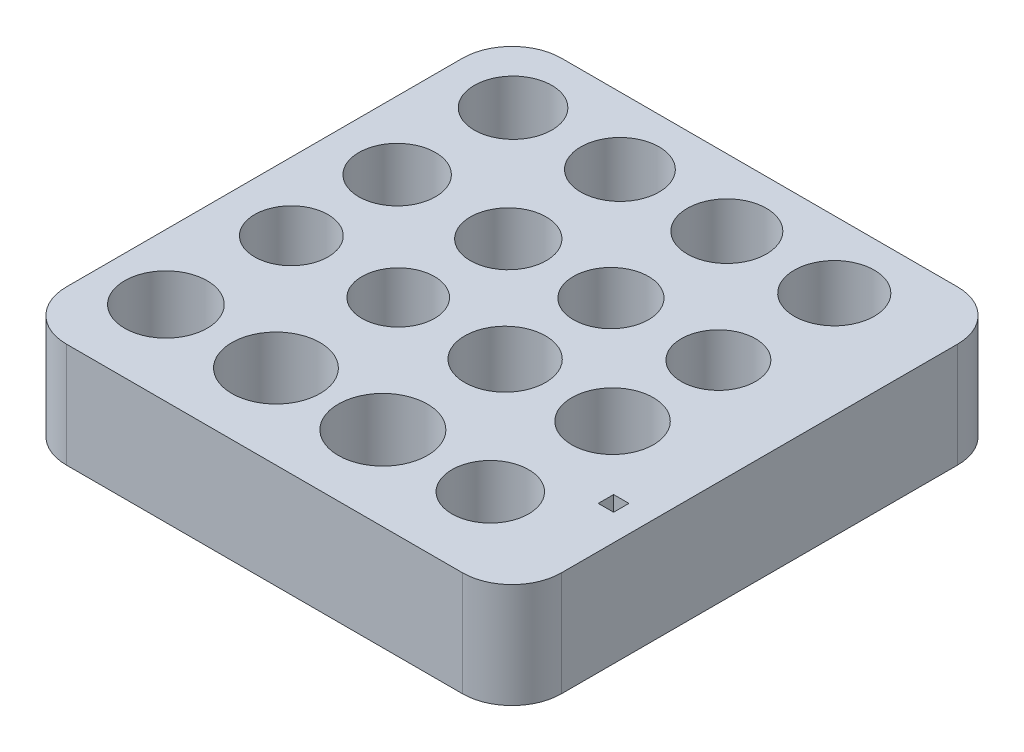
ISO-10303-21;
HEADER;
FILE_DESCRIPTION(('STEP AP214'),'2;1');
FILE_NAME('part.step','',(''),(''),'','','');
FILE_SCHEMA(('AUTOMOTIVE_DESIGN { 1 0 10303 214 1 1 1 1 }'));
ENDSEC;
DATA;
#1=APPLICATION_CONTEXT('core data for automotive mechanical design processes');
#2=APPLICATION_PROTOCOL_DEFINITION('international standard','automotive_design',2000,#1);
#3=PRODUCT_CONTEXT('',#1,'mechanical');
#4=PRODUCT('Part','Part','',(#3));
#5=PRODUCT_RELATED_PRODUCT_CATEGORY('part','',(#4));
#6=PRODUCT_DEFINITION_FORMATION('','',#4);
#7=PRODUCT_DEFINITION_CONTEXT('part definition',#1,'design');
#8=PRODUCT_DEFINITION('design','',#6,#7);
#9=PRODUCT_DEFINITION_SHAPE('','',#8);
#10=(LENGTH_UNIT() NAMED_UNIT(*) SI_UNIT(.MILLI.,.METRE.));
#11=(NAMED_UNIT(*) PLANE_ANGLE_UNIT() SI_UNIT($,.RADIAN.));
#12=(NAMED_UNIT(*) SI_UNIT($,.STERADIAN.) SOLID_ANGLE_UNIT());
#13=UNCERTAINTY_MEASURE_WITH_UNIT(LENGTH_MEASURE(1.E-05),#10,'distance_accuracy_value','');
#14=(GEOMETRIC_REPRESENTATION_CONTEXT(3) GLOBAL_UNCERTAINTY_ASSIGNED_CONTEXT((#13)) GLOBAL_UNIT_ASSIGNED_CONTEXT((#10,
#11,#12)) REPRESENTATION_CONTEXT('',''));
#15=CARTESIAN_POINT('',(0.,0.,0.));
#16=DIRECTION('',(0.,0.,1.));
#17=DIRECTION('',(1.,0.,0.));
#18=AXIS2_PLACEMENT_3D('',#15,#16,#17);
#19=CARTESIAN_POINT('',(3.,6.35,-3.));
#20=DIRECTION('',(0.,-1.,0.));
#21=DIRECTION('',(0.,0.,-1.));
#22=AXIS2_PLACEMENT_3D('',#19,#20,#21);
#23=CYLINDRICAL_SURFACE('',#22,3.);
#24=CARTESIAN_POINT('',(3.,0.,-3.));
#25=DIRECTION('',(0.,1.,0.));
#26=DIRECTION('',(0.,0.,-1.));
#27=AXIS2_PLACEMENT_3D('',#24,#25,#26);
#28=CIRCLE('',#27,3.);
#29=CARTESIAN_POINT('',(0.,0.,-3.00000000000002));
#30=VERTEX_POINT('',#29);
#31=CARTESIAN_POINT('',(3.00000000000002,0.,0.));
#32=VERTEX_POINT('',#31);
#33=EDGE_CURVE('E281',#30,#32,#28,.T.);
#34=ORIENTED_EDGE('',*,*,#33,.T.);
#35=DIRECTION('',(0.,-1.,0.));
#36=VECTOR('',#35,1.);
#37=CARTESIAN_POINT('',(3.00000000000002,6.35,0.));
#38=LINE('',#37,#36);
#39=CARTESIAN_POINT('',(3.00000000000002,6.35,0.));
#40=VERTEX_POINT('',#39);
#41=EDGE_CURVE('E11',#40,#32,#38,.T.);
#42=ORIENTED_EDGE('',*,*,#41,.F.);
#43=CARTESIAN_POINT('',(3.,6.35,-3.));
#44=DIRECTION('',(0.,1.,0.));
#45=DIRECTION('',(0.,0.,-1.));
#46=AXIS2_PLACEMENT_3D('',#43,#44,#45);
#47=CIRCLE('',#46,3.);
#48=CARTESIAN_POINT('',(0.,6.35,-3.00000000000002));
#49=VERTEX_POINT('',#48);
#50=EDGE_CURVE('E285',#49,#40,#47,.T.);
#51=ORIENTED_EDGE('',*,*,#50,.F.);
#52=DIRECTION('',(0.,-1.,0.));
#53=VECTOR('',#52,1.);
#54=CARTESIAN_POINT('',(0.,6.35,-3.00000000000002));
#55=LINE('',#54,#53);
#56=EDGE_CURVE('E311',#49,#30,#55,.T.);
#57=ORIENTED_EDGE('',*,*,#56,.T.);
#58=EDGE_LOOP('',(#34,#42,#51,#57));
#59=FACE_BOUND('',#58,.T.);
#60=ADVANCED_FACE('F39',(#59),#23,.T.);
#61=CARTESIAN_POINT('',(3.00000000000002,6.35,0.));
#62=DIRECTION('',(0.,0.,-1.));
#63=DIRECTION('',(-1.,0.,0.));
#64=AXIS2_PLACEMENT_3D('',#61,#62,#63);
#65=PLANE('',#64);
#66=DIRECTION('',(1.,0.,0.));
#67=VECTOR('',#66,1.);
#68=CARTESIAN_POINT('',(3.00000000000002,0.,0.));
#69=LINE('',#68,#67);
#70=CARTESIAN_POINT('',(27.,0.,0.));
#71=VERTEX_POINT('',#70);
#72=EDGE_CURVE('E315',#32,#71,#69,.T.);
#73=ORIENTED_EDGE('',*,*,#72,.T.);
#74=DIRECTION('',(0.,-1.,0.));
#75=VECTOR('',#74,1.);
#76=CARTESIAN_POINT('',(27.,6.35,0.));
#77=LINE('',#76,#75);
#78=CARTESIAN_POINT('',(27.,6.35,0.));
#79=VERTEX_POINT('',#78);
#80=EDGE_CURVE('E47',#79,#71,#77,.T.);
#81=ORIENTED_EDGE('',*,*,#80,.F.);
#82=DIRECTION('',(1.,0.,0.));
#83=VECTOR('',#82,1.);
#84=CARTESIAN_POINT('',(3.00000000000002,6.35,0.));
#85=LINE('',#84,#83);
#86=EDGE_CURVE('E289',#40,#79,#85,.T.);
#87=ORIENTED_EDGE('',*,*,#86,.F.);
#88=ORIENTED_EDGE('',*,*,#41,.T.);
#89=EDGE_LOOP('',(#73,#81,#87,#88));
#90=FACE_BOUND('',#89,.T.);
#91=ADVANCED_FACE('F385',(#90),#65,.F.);
#92=CARTESIAN_POINT('',(27.,6.35,-3.));
#93=DIRECTION('',(0.,-1.,0.));
#94=DIRECTION('',(0.,0.,-1.));
#95=AXIS2_PLACEMENT_3D('',#92,#93,#94);
#96=CYLINDRICAL_SURFACE('',#95,3.);
#97=CARTESIAN_POINT('',(27.,0.,-3.));
#98=DIRECTION('',(0.,1.,0.));
#99=DIRECTION('',(0.,0.,1.));
#100=AXIS2_PLACEMENT_3D('',#97,#98,#99);
#101=CIRCLE('',#100,3.);
#102=CARTESIAN_POINT('',(30.,0.,-3.00000000000002));
#103=VERTEX_POINT('',#102);
#104=EDGE_CURVE('E318',#71,#103,#101,.T.);
#105=ORIENTED_EDGE('',*,*,#104,.T.);
#106=DIRECTION('',(0.,-1.,0.));
#107=VECTOR('',#106,1.);
#108=CARTESIAN_POINT('',(30.,6.35,-3.00000000000002));
#109=LINE('',#108,#107);
#110=CARTESIAN_POINT('',(30.,6.35,-3.00000000000002));
#111=VERTEX_POINT('',#110);
#112=EDGE_CURVE('E354',#111,#103,#109,.T.);
#113=ORIENTED_EDGE('',*,*,#112,.F.);
#114=CARTESIAN_POINT('',(27.,6.35,-3.));
#115=DIRECTION('',(0.,1.,0.));
#116=DIRECTION('',(0.,0.,1.));
#117=AXIS2_PLACEMENT_3D('',#114,#115,#116);
#118=CIRCLE('',#117,3.);
#119=EDGE_CURVE('E293',#79,#111,#118,.T.);
#120=ORIENTED_EDGE('',*,*,#119,.F.);
#121=ORIENTED_EDGE('',*,*,#80,.T.);
#122=EDGE_LOOP('',(#105,#113,#120,#121));
#123=FACE_BOUND('',#122,.T.);
#124=ADVANCED_FACE('F363',(#123),#96,.T.);
#125=CARTESIAN_POINT('',(30.,6.35,-3.00000000000002));
#126=DIRECTION('',(-1.,0.,0.));
#127=DIRECTION('',(0.,0.,1.));
#128=AXIS2_PLACEMENT_3D('',#125,#126,#127);
#129=PLANE('',#128);
#130=DIRECTION('',(0.,0.,-1.));
#131=VECTOR('',#130,1.);
#132=CARTESIAN_POINT('',(30.,0.,-3.00000000000002));
#133=LINE('',#132,#131);
#134=CARTESIAN_POINT('',(30.,0.,-27.));
#135=VERTEX_POINT('',#134);
#136=EDGE_CURVE('E321',#103,#135,#133,.T.);
#137=ORIENTED_EDGE('',*,*,#136,.T.);
#138=DIRECTION('',(0.,-1.,0.));
#139=VECTOR('',#138,1.);
#140=CARTESIAN_POINT('',(30.,6.35,-27.));
#141=LINE('',#140,#139);
#142=CARTESIAN_POINT('',(30.,6.35,-27.));
#143=VERTEX_POINT('',#142);
#144=EDGE_CURVE('E350',#143,#135,#141,.T.);
#145=ORIENTED_EDGE('',*,*,#144,.F.);
#146=DIRECTION('',(0.,0.,-1.));
#147=VECTOR('',#146,1.);
#148=CARTESIAN_POINT('',(30.,6.35,-3.00000000000002));
#149=LINE('',#148,#147);
#150=EDGE_CURVE('E296',#111,#143,#149,.T.);
#151=ORIENTED_EDGE('',*,*,#150,.F.);
#152=ORIENTED_EDGE('',*,*,#112,.T.);
#153=EDGE_LOOP('',(#137,#145,#151,#152));
#154=FACE_BOUND('',#153,.T.);
#155=ADVANCED_FACE('F373',(#154),#129,.F.);
#156=CARTESIAN_POINT('',(27.,6.35,-27.));
#157=DIRECTION('',(0.,-1.,0.));
#158=DIRECTION('',(0.,0.,-1.));
#159=AXIS2_PLACEMENT_3D('',#156,#157,#158);
#160=CYLINDRICAL_SURFACE('',#159,3.);
#161=CARTESIAN_POINT('',(27.,0.,-27.));
#162=DIRECTION('',(0.,1.,0.));
#163=DIRECTION('',(0.,0.,-1.));
#164=AXIS2_PLACEMENT_3D('',#161,#162,#163);
#165=CIRCLE('',#164,3.);
#166=CARTESIAN_POINT('',(27.,0.,-30.));
#167=VERTEX_POINT('',#166);
#168=EDGE_CURVE('E324',#135,#167,#165,.T.);
#169=ORIENTED_EDGE('',*,*,#168,.T.);
#170=DIRECTION('',(0.,-1.,0.));
#171=VECTOR('',#170,1.);
#172=CARTESIAN_POINT('',(27.,6.35,-30.));
#173=LINE('',#172,#171);
#174=CARTESIAN_POINT('',(27.,6.35,-30.));
#175=VERTEX_POINT('',#174);
#176=EDGE_CURVE('E346',#175,#167,#173,.T.);
#177=ORIENTED_EDGE('',*,*,#176,.F.);
#178=CARTESIAN_POINT('',(27.,6.35,-27.));
#179=DIRECTION('',(0.,1.,0.));
#180=DIRECTION('',(0.,0.,-1.));
#181=AXIS2_PLACEMENT_3D('',#178,#179,#180);
#182=CIRCLE('',#181,3.);
#183=EDGE_CURVE('E299',#143,#175,#182,.T.);
#184=ORIENTED_EDGE('',*,*,#183,.F.);
#185=ORIENTED_EDGE('',*,*,#144,.T.);
#186=EDGE_LOOP('',(#169,#177,#184,#185));
#187=FACE_BOUND('',#186,.T.);
#188=ADVANCED_FACE('F377',(#187),#160,.T.);
#189=CARTESIAN_POINT('',(3.00000000000002,6.35,-30.));
#190=DIRECTION('',(0.,0.,1.));
#191=DIRECTION('',(1.,0.,0.));
#192=AXIS2_PLACEMENT_3D('',#189,#190,#191);
#193=PLANE('',#192);
#194=DIRECTION('',(-1.,0.,0.));
#195=VECTOR('',#194,1.);
#196=CARTESIAN_POINT('',(3.00000000000002,0.,-30.));
#197=LINE('',#196,#195);
#198=CARTESIAN_POINT('',(3.00000000000002,0.,-30.));
#199=VERTEX_POINT('',#198);
#200=EDGE_CURVE('E327',#167,#199,#197,.T.);
#201=ORIENTED_EDGE('',*,*,#200,.T.);
#202=DIRECTION('',(0.,-1.,0.));
#203=VECTOR('',#202,1.);
#204=CARTESIAN_POINT('',(3.00000000000002,6.35,-30.));
#205=LINE('',#204,#203);
#206=CARTESIAN_POINT('',(3.00000000000002,6.35,-30.));
#207=VERTEX_POINT('',#206);
#208=EDGE_CURVE('E342',#207,#199,#205,.T.);
#209=ORIENTED_EDGE('',*,*,#208,.F.);
#210=DIRECTION('',(-1.,0.,0.));
#211=VECTOR('',#210,1.);
#212=CARTESIAN_POINT('',(3.00000000000002,6.35,-30.));
#213=LINE('',#212,#211);
#214=EDGE_CURVE('E302',#175,#207,#213,.T.);
#215=ORIENTED_EDGE('',*,*,#214,.F.);
#216=ORIENTED_EDGE('',*,*,#176,.T.);
#217=EDGE_LOOP('',(#201,#209,#215,#216));
#218=FACE_BOUND('',#217,.T.);
#219=ADVANCED_FACE('F398',(#218),#193,.F.);
#220=CARTESIAN_POINT('',(3.,6.35,-27.));
#221=DIRECTION('',(0.,-1.,0.));
#222=DIRECTION('',(0.,0.,-1.));
#223=AXIS2_PLACEMENT_3D('',#220,#221,#222);
#224=CYLINDRICAL_SURFACE('',#223,3.);
#225=CARTESIAN_POINT('',(3.,0.,-27.));
#226=DIRECTION('',(0.,1.,0.));
#227=DIRECTION('',(0.,0.,-1.));
#228=AXIS2_PLACEMENT_3D('',#225,#226,#227);
#229=CIRCLE('',#228,3.);
#230=CARTESIAN_POINT('',(0.,0.,-27.));
#231=VERTEX_POINT('',#230);
#232=EDGE_CURVE('E330',#199,#231,#229,.T.);
#233=ORIENTED_EDGE('',*,*,#232,.T.);
#234=DIRECTION('',(0.,-1.,0.));
#235=VECTOR('',#234,1.);
#236=CARTESIAN_POINT('',(0.,6.35,-27.));
#237=LINE('',#236,#235);
#238=CARTESIAN_POINT('',(0.,6.35,-27.));
#239=VERTEX_POINT('',#238);
#240=EDGE_CURVE('E338',#239,#231,#237,.T.);
#241=ORIENTED_EDGE('',*,*,#240,.F.);
#242=CARTESIAN_POINT('',(3.,6.35,-27.));
#243=DIRECTION('',(0.,1.,0.));
#244=DIRECTION('',(0.,0.,-1.));
#245=AXIS2_PLACEMENT_3D('',#242,#243,#244);
#246=CIRCLE('',#245,3.);
#247=EDGE_CURVE('E305',#207,#239,#246,.T.);
#248=ORIENTED_EDGE('',*,*,#247,.F.);
#249=ORIENTED_EDGE('',*,*,#208,.T.);
#250=EDGE_LOOP('',(#233,#241,#248,#249));
#251=FACE_BOUND('',#250,.T.);
#252=ADVANCED_FACE('F396',(#251),#224,.T.);
#253=CARTESIAN_POINT('',(0.,6.35,-3.00000000000002));
#254=DIRECTION('',(1.,0.,0.));
#255=DIRECTION('',(0.,0.,-1.));
#256=AXIS2_PLACEMENT_3D('',#253,#254,#255);
#257=PLANE('',#256);
#258=DIRECTION('',(0.,0.,1.));
#259=VECTOR('',#258,1.);
#260=CARTESIAN_POINT('',(0.,0.,-3.00000000000002));
#261=LINE('',#260,#259);
#262=EDGE_CURVE('E290',#231,#30,#261,.T.);
#263=ORIENTED_EDGE('',*,*,#262,.T.);
#264=ORIENTED_EDGE('',*,*,#56,.F.);
#265=DIRECTION('',(0.,0.,1.));
#266=VECTOR('',#265,1.);
#267=CARTESIAN_POINT('',(0.,6.35,-3.00000000000002));
#268=LINE('',#267,#266);
#269=EDGE_CURVE('E308',#239,#49,#268,.T.);
#270=ORIENTED_EDGE('',*,*,#269,.F.);
#271=ORIENTED_EDGE('',*,*,#240,.T.);
#272=EDGE_LOOP('',(#263,#264,#270,#271));
#273=FACE_BOUND('',#272,.T.);
#274=ADVANCED_FACE('F391',(#273),#257,.F.);
#275=CARTESIAN_POINT('',(3.,6.35,-3.));
#276=DIRECTION('',(0.,-1.,0.));
#277=DIRECTION('',(0.,0.,-1.));
#278=AXIS2_PLACEMENT_3D('',#275,#276,#277);
#279=PLANE('',#278);
#280=CARTESIAN_POINT('',(10.8637767540645,6.35,-18.9117770232878));
#281=DIRECTION('',(0.,1.,0.));
#282=DIRECTION('',(0.,0.,1.));
#283=AXIS2_PLACEMENT_3D('',#280,#281,#282);
#284=CIRCLE('',#283,2.3);
#285=CARTESIAN_POINT('',(10.8637767540645,6.35,-16.6117770232878));
#286=VERTEX_POINT('',#285);
#287=EDGE_CURVE('E234',#286,#286,#284,.T.);
#288=ORIENTED_EDGE('',*,*,#287,.F.);
#289=EDGE_LOOP('',(#288));
#290=FACE_BOUND('',#289,.T.);
#291=CARTESIAN_POINT('',(23.5930839527962,6.35,-18.9117770232878));
#292=DIRECTION('',(0.,1.,0.));
#293=DIRECTION('',(0.,0.,1.));
#294=AXIS2_PLACEMENT_3D('',#291,#292,#293);
#295=CIRCLE('',#294,2.25);
#296=CARTESIAN_POINT('',(23.5930839527962,6.35,-16.6617770232878));
#297=VERTEX_POINT('',#296);
#298=EDGE_CURVE('E217',#297,#297,#295,.T.);
#299=ORIENTED_EDGE('',*,*,#298,.F.);
#300=EDGE_LOOP('',(#299));
#301=FACE_BOUND('',#300,.T.);
#302=CARTESIAN_POINT('',(10.6072667853243,6.35,-25.9337374175504));
#303=DIRECTION('',(0.,1.,0.));
#304=DIRECTION('',(0.,0.,1.));
#305=AXIS2_PLACEMENT_3D('',#302,#303,#304);
#306=CIRCLE('',#305,2.375);
#307=CARTESIAN_POINT('',(10.6072667853243,6.35,-23.5587374175504));
#308=VERTEX_POINT('',#307);
#309=EDGE_CURVE('E218',#308,#308,#306,.T.);
#310=ORIENTED_EDGE('',*,*,#309,.F.);
#311=EDGE_LOOP('',(#310));
#312=FACE_BOUND('',#311,.T.);
#313=CARTESIAN_POINT('',(4.13039007463468,6.35,-12.4990278047832));
#314=DIRECTION('',(0.,1.,0.));
#315=DIRECTION('',(0.,0.,1.));
#316=AXIS2_PLACEMENT_3D('',#313,#314,#315);
#317=CIRCLE('',#316,2.225);
#318=CARTESIAN_POINT('',(4.13039007463468,6.35,-10.2740278047832));
#319=VERTEX_POINT('',#318);
#320=EDGE_CURVE('E201',#319,#319,#317,.T.);
#321=ORIENTED_EDGE('',*,*,#320,.F.);
#322=EDGE_LOOP('',(#321));
#323=FACE_BOUND('',#322,.T.);
#324=CARTESIAN_POINT('',(17.084143496014,6.35,-25.9337374175504));
#325=DIRECTION('',(0.,1.,0.));
#326=DIRECTION('',(0.,0.,1.));
#327=AXIS2_PLACEMENT_3D('',#324,#325,#326);
#328=CIRCLE('',#327,2.4);
#329=CARTESIAN_POINT('',(17.084143496014,6.35,-23.5337374175504));
#330=VERTEX_POINT('',#329);
#331=EDGE_CURVE('E266',#330,#330,#328,.T.);
#332=ORIENTED_EDGE('',*,*,#331,.F.);
#333=EDGE_LOOP('',(#332));
#334=FACE_BOUND('',#333,.T.);
#335=CARTESIAN_POINT('',(4.13039007463468,6.35,-18.9117770232878));
#336=DIRECTION('',(0.,1.,0.));
#337=DIRECTION('',(0.,0.,1.));
#338=AXIS2_PLACEMENT_3D('',#335,#336,#337);
#339=CIRCLE('',#338,2.325);
#340=CARTESIAN_POINT('',(4.13039007463468,6.35,-16.5867770232878));
#341=VERTEX_POINT('',#340);
#342=EDGE_CURVE('E249',#341,#341,#339,.T.);
#343=ORIENTED_EDGE('',*,*,#342,.F.);
#344=EDGE_LOOP('',(#343));
#345=FACE_BOUND('',#344,.T.);
#346=CARTESIAN_POINT('',(17.084143496014,6.35,-18.9117770232878));
#347=DIRECTION('',(0.,1.,0.));
#348=DIRECTION('',(0.,0.,1.));
#349=AXIS2_PLACEMENT_3D('',#346,#347,#348);
#350=CIRCLE('',#349,2.275);
#351=CARTESIAN_POINT('',(17.084143496014,6.35,-16.6367770232878));
#352=VERTEX_POINT('',#351);
#353=EDGE_CURVE('E250',#352,#352,#350,.T.);
#354=ORIENTED_EDGE('',*,*,#353,.F.);
#355=EDGE_LOOP('',(#354));
#356=FACE_BOUND('',#355,.T.);
#357=CARTESIAN_POINT('',(23.5930839527962,6.35,-25.9337374175504));
#358=DIRECTION('',(0.,1.,0.));
#359=DIRECTION('',(0.,0.,1.));
#360=AXIS2_PLACEMENT_3D('',#357,#358,#359);
#361=CIRCLE('',#360,2.425);
#362=CARTESIAN_POINT('',(23.5930839527962,6.35,-23.5087374175504));
#363=VERTEX_POINT('',#362);
#364=EDGE_CURVE('E233',#363,#363,#361,.T.);
#365=ORIENTED_EDGE('',*,*,#364,.F.);
#366=EDGE_LOOP('',(#365));
#367=FACE_BOUND('',#366,.T.);
#368=DIRECTION('',(1.,0.,0.));
#369=VECTOR('',#368,1.);
#370=CARTESIAN_POINT('',(27.4727972299915,6.35,-7.75359338308981));
#371=LINE('',#370,#369);
#372=CARTESIAN_POINT('',(27.4727972299915,6.35,-7.75359338308981));
#373=VERTEX_POINT('',#372);
#374=CARTESIAN_POINT('',(28.4026458666746,6.35,-7.75359338308981));
#375=VERTEX_POINT('',#374);
#376=EDGE_CURVE('E165',#373,#375,#371,.T.);
#377=ORIENTED_EDGE('',*,*,#376,.F.);
#378=DIRECTION('',(0.,0.,1.));
#379=VECTOR('',#378,1.);
#380=CARTESIAN_POINT('',(27.4727972299915,6.35,-8.68344201977298));
#381=LINE('',#380,#379);
#382=CARTESIAN_POINT('',(27.4727972299915,6.35,-8.68344201977298));
#383=VERTEX_POINT('',#382);
#384=EDGE_CURVE('E54',#383,#373,#381,.T.);
#385=ORIENTED_EDGE('',*,*,#384,.F.);
#386=DIRECTION('',(-1.,0.,0.));
#387=VECTOR('',#386,1.);
#388=CARTESIAN_POINT('',(27.4727972299915,6.35,-8.68344201977298));
#389=LINE('',#388,#387);
#390=CARTESIAN_POINT('',(28.4026458666746,6.35,-8.68344201977298));
#391=VERTEX_POINT('',#390);
#392=EDGE_CURVE('E149',#391,#383,#389,.T.);
#393=ORIENTED_EDGE('',*,*,#392,.F.);
#394=DIRECTION('',(0.,0.,-1.));
#395=VECTOR('',#394,1.);
#396=CARTESIAN_POINT('',(28.4026458666746,6.35,-8.68344201977298));
#397=LINE('',#396,#395);
#398=EDGE_CURVE('E153',#375,#391,#397,.T.);
#399=ORIENTED_EDGE('',*,*,#398,.F.);
#400=EDGE_LOOP('',(#377,#385,#393,#399));
#401=FACE_BOUND('',#400,.T.);
#402=CARTESIAN_POINT('',(23.5930839527962,6.35,-5.0923024574104));
#403=DIRECTION('',(0.,1.,0.));
#404=DIRECTION('',(0.,0.,1.));
#405=AXIS2_PLACEMENT_3D('',#402,#403,#404);
#406=CIRCLE('',#405,2.325);
#407=CARTESIAN_POINT('',(23.5930839527962,6.35,-2.76730245741039));
#408=VERTEX_POINT('',#407);
#409=EDGE_CURVE('E156',#408,#408,#406,.T.);
#410=ORIENTED_EDGE('',*,*,#409,.F.);
#411=EDGE_LOOP('',(#410));
#412=FACE_BOUND('',#411,.T.);
#413=CARTESIAN_POINT('',(17.084143496014,6.35,-5.0923024574104));
#414=DIRECTION('',(0.,1.,0.));
#415=DIRECTION('',(0.,0.,1.));
#416=AXIS2_PLACEMENT_3D('',#413,#414,#415);
#417=CIRCLE('',#416,2.7);
#418=CARTESIAN_POINT('',(17.084143496014,6.35,-2.39230245741039));
#419=VERTEX_POINT('',#418);
#420=EDGE_CURVE('E686',#419,#419,#417,.T.);
#421=ORIENTED_EDGE('',*,*,#420,.F.);
#422=EDGE_LOOP('',(#421));
#423=FACE_BOUND('',#422,.T.);
#424=CARTESIAN_POINT('',(3.93800759807954,6.35,-5.0923024574104));
#425=DIRECTION('',(0.,1.,0.));
#426=DIRECTION('',(0.,0.,1.));
#427=AXIS2_PLACEMENT_3D('',#424,#425,#426);
#428=CIRCLE('',#427,2.5);
#429=CARTESIAN_POINT('',(3.93800759807954,6.35,-2.59230245741039));
#430=VERTEX_POINT('',#429);
#431=EDGE_CURVE('E690',#430,#430,#428,.T.);
#432=ORIENTED_EDGE('',*,*,#431,.F.);
#433=EDGE_LOOP('',(#432));
#434=FACE_BOUND('',#433,.T.);
#435=CARTESIAN_POINT('',(17.084143496014,6.35,-12.4990278047832));
#436=DIRECTION('',(0.,1.,0.));
#437=DIRECTION('',(0.,0.,1.));
#438=AXIS2_PLACEMENT_3D('',#435,#436,#437);
#439=CIRCLE('',#438,2.45);
#440=CARTESIAN_POINT('',(17.084143496014,6.35,-10.0490278047832));
#441=VERTEX_POINT('',#440);
#442=EDGE_CURVE('E202',#441,#441,#439,.T.);
#443=ORIENTED_EDGE('',*,*,#442,.F.);
#444=EDGE_LOOP('',(#443));
#445=FACE_BOUND('',#444,.T.);
#446=CARTESIAN_POINT('',(10.6072667853243,6.35,-12.4990278047832));
#447=DIRECTION('',(0.,1.,0.));
#448=DIRECTION('',(0.,0.,1.));
#449=AXIS2_PLACEMENT_3D('',#446,#447,#448);
#450=CIRCLE('',#449,2.2);
#451=CARTESIAN_POINT('',(10.6072667853243,6.35,-10.2990278047832));
#452=VERTEX_POINT('',#451);
#453=EDGE_CURVE('E183',#452,#452,#450,.T.);
#454=ORIENTED_EDGE('',*,*,#453,.F.);
#455=EDGE_LOOP('',(#454));
#456=FACE_BOUND('',#455,.T.);
#457=CARTESIAN_POINT('',(23.5930839527962,6.35,-12.4990278047832));
#458=DIRECTION('',(0.,1.,0.));
#459=DIRECTION('',(0.,0.,1.));
#460=AXIS2_PLACEMENT_3D('',#457,#458,#459);
#461=CIRCLE('',#460,2.475);
#462=CARTESIAN_POINT('',(23.5930839527962,6.35,-10.0240278047832));
#463=VERTEX_POINT('',#462);
#464=EDGE_CURVE('E184',#463,#463,#461,.T.);
#465=ORIENTED_EDGE('',*,*,#464,.F.);
#466=EDGE_LOOP('',(#465));
#467=FACE_BOUND('',#466,.T.);
#468=CARTESIAN_POINT('',(10.6072667853243,6.35,-5.0923024574104));
#469=DIRECTION('',(0.,1.,0.));
#470=DIRECTION('',(0.,0.,1.));
#471=AXIS2_PLACEMENT_3D('',#468,#469,#470);
#472=CIRCLE('',#471,2.675);
#473=CARTESIAN_POINT('',(10.6072667853243,6.35,-2.41730245741039));
#474=VERTEX_POINT('',#473);
#475=EDGE_CURVE('E192',#474,#474,#472,.T.);
#476=ORIENTED_EDGE('',*,*,#475,.F.);
#477=EDGE_LOOP('',(#476));
#478=FACE_BOUND('',#477,.T.);
#479=CARTESIAN_POINT('',(4.13039007463468,6.35,-25.9337374175504));
#480=DIRECTION('',(0.,1.,0.));
#481=DIRECTION('',(0.,0.,1.));
#482=AXIS2_PLACEMENT_3D('',#479,#480,#481);
#483=CIRCLE('',#482,2.35);
#484=CARTESIAN_POINT('',(4.13039007463468,6.35,-23.5837374175504));
#485=VERTEX_POINT('',#484);
#486=EDGE_CURVE('E265',#485,#485,#483,.T.);
#487=ORIENTED_EDGE('',*,*,#486,.F.);
#488=EDGE_LOOP('',(#487));
#489=FACE_BOUND('',#488,.T.);
#490=ORIENTED_EDGE('',*,*,#50,.T.);
#491=ORIENTED_EDGE('',*,*,#86,.T.);
#492=ORIENTED_EDGE('',*,*,#119,.T.);
#493=ORIENTED_EDGE('',*,*,#150,.T.);
#494=ORIENTED_EDGE('',*,*,#183,.T.);
#495=ORIENTED_EDGE('',*,*,#214,.T.);
#496=ORIENTED_EDGE('',*,*,#247,.T.);
#497=ORIENTED_EDGE('',*,*,#269,.T.);
#498=EDGE_LOOP('',(#490,#491,#492,#493,#494,#495,#496,#497));
#499=FACE_BOUND('',#498,.T.);
#500=ADVANCED_FACE('F381',(#290,#301,#312,#323,#334,#345,#356,#367,#401,#412,#423,#434,#445,
#456,#467,#478,#489,#499),#279,.F.);
#501=CARTESIAN_POINT('',(3.,0.,-3.));
#502=DIRECTION('',(0.,-1.,0.));
#503=DIRECTION('',(0.,0.,-1.));
#504=AXIS2_PLACEMENT_3D('',#501,#502,#503);
#505=PLANE('',#504);
#506=CARTESIAN_POINT('',(10.8637767540645,0.,-18.9117770232878));
#507=DIRECTION('',(0.,1.,0.));
#508=DIRECTION('',(0.,0.,1.));
#509=AXIS2_PLACEMENT_3D('',#506,#507,#508);
#510=CIRCLE('',#509,2.3);
#511=CARTESIAN_POINT('',(10.8637767540645,0.,-16.6117770232878));
#512=VERTEX_POINT('',#511);
#513=EDGE_CURVE('E229',#512,#512,#510,.T.);
#514=ORIENTED_EDGE('',*,*,#513,.T.);
#515=EDGE_LOOP('',(#514));
#516=FACE_BOUND('',#515,.T.);
#517=CARTESIAN_POINT('',(23.5930839527962,0.,-18.9117770232878));
#518=DIRECTION('',(0.,1.,0.));
#519=DIRECTION('',(0.,0.,1.));
#520=AXIS2_PLACEMENT_3D('',#517,#518,#519);
#521=CIRCLE('',#520,2.25);
#522=CARTESIAN_POINT('',(23.5930839527962,0.,-16.6617770232878));
#523=VERTEX_POINT('',#522);
#524=EDGE_CURVE('E238',#523,#523,#521,.T.);
#525=ORIENTED_EDGE('',*,*,#524,.T.);
#526=EDGE_LOOP('',(#525));
#527=FACE_BOUND('',#526,.T.);
#528=CARTESIAN_POINT('',(10.6072667853243,0.,-25.9337374175504));
#529=DIRECTION('',(0.,1.,0.));
#530=DIRECTION('',(0.,0.,1.));
#531=AXIS2_PLACEMENT_3D('',#528,#529,#530);
#532=CIRCLE('',#531,2.375);
#533=CARTESIAN_POINT('',(10.6072667853243,0.,-23.5587374175504));
#534=VERTEX_POINT('',#533);
#535=EDGE_CURVE('E213',#534,#534,#532,.T.);
#536=ORIENTED_EDGE('',*,*,#535,.T.);
#537=EDGE_LOOP('',(#536));
#538=FACE_BOUND('',#537,.T.);
#539=CARTESIAN_POINT('',(4.13039007463468,0.,-12.4990278047832));
#540=DIRECTION('',(0.,1.,0.));
#541=DIRECTION('',(0.,0.,1.));
#542=AXIS2_PLACEMENT_3D('',#539,#540,#541);
#543=CIRCLE('',#542,2.225);
#544=CARTESIAN_POINT('',(4.13039007463468,0.,-10.2740278047832));
#545=VERTEX_POINT('',#544);
#546=EDGE_CURVE('E222',#545,#545,#543,.T.);
#547=ORIENTED_EDGE('',*,*,#546,.T.);
#548=EDGE_LOOP('',(#547));
#549=FACE_BOUND('',#548,.T.);
#550=CARTESIAN_POINT('',(17.084143496014,0.,-25.9337374175504));
#551=DIRECTION('',(0.,1.,0.));
#552=DIRECTION('',(0.,0.,1.));
#553=AXIS2_PLACEMENT_3D('',#550,#551,#552);
#554=CIRCLE('',#553,2.4);
#555=CARTESIAN_POINT('',(17.084143496014,0.,-23.5337374175504));
#556=VERTEX_POINT('',#555);
#557=EDGE_CURVE('E261',#556,#556,#554,.T.);
#558=ORIENTED_EDGE('',*,*,#557,.T.);
#559=EDGE_LOOP('',(#558));
#560=FACE_BOUND('',#559,.T.);
#561=CARTESIAN_POINT('',(4.13039007463468,0.,-18.9117770232878));
#562=DIRECTION('',(0.,1.,0.));
#563=DIRECTION('',(0.,0.,1.));
#564=AXIS2_PLACEMENT_3D('',#561,#562,#563);
#565=CIRCLE('',#564,2.325);
#566=CARTESIAN_POINT('',(4.13039007463468,0.,-16.5867770232878));
#567=VERTEX_POINT('',#566);
#568=EDGE_CURVE('E270',#567,#567,#565,.T.);
#569=ORIENTED_EDGE('',*,*,#568,.T.);
#570=EDGE_LOOP('',(#569));
#571=FACE_BOUND('',#570,.T.);
#572=CARTESIAN_POINT('',(17.084143496014,0.,-18.9117770232878));
#573=DIRECTION('',(0.,1.,0.));
#574=DIRECTION('',(0.,0.,1.));
#575=AXIS2_PLACEMENT_3D('',#572,#573,#574);
#576=CIRCLE('',#575,2.275);
#577=CARTESIAN_POINT('',(17.084143496014,0.,-16.6367770232878));
#578=VERTEX_POINT('',#577);
#579=EDGE_CURVE('E245',#578,#578,#576,.T.);
#580=ORIENTED_EDGE('',*,*,#579,.T.);
#581=EDGE_LOOP('',(#580));
#582=FACE_BOUND('',#581,.T.);
#583=CARTESIAN_POINT('',(23.5930839527962,0.,-25.9337374175504));
#584=DIRECTION('',(0.,1.,0.));
#585=DIRECTION('',(0.,0.,1.));
#586=AXIS2_PLACEMENT_3D('',#583,#584,#585);
#587=CIRCLE('',#586,2.425);
#588=CARTESIAN_POINT('',(23.5930839527962,0.,-23.5087374175504));
#589=VERTEX_POINT('',#588);
#590=EDGE_CURVE('E254',#589,#589,#587,.T.);
#591=ORIENTED_EDGE('',*,*,#590,.T.);
#592=EDGE_LOOP('',(#591));
#593=FACE_BOUND('',#592,.T.);
#594=DIRECTION('',(0.,0.,1.));
#595=VECTOR('',#594,1.);
#596=CARTESIAN_POINT('',(27.4727972299915,0.,-8.68344201977298));
#597=LINE('',#596,#595);
#598=CARTESIAN_POINT('',(27.4727972299915,0.,-8.68344201977298));
#599=VERTEX_POINT('',#598);
#600=CARTESIAN_POINT('',(27.4727972299915,0.,-7.75359338308981));
#601=VERTEX_POINT('',#600);
#602=EDGE_CURVE('E130',#599,#601,#597,.T.);
#603=ORIENTED_EDGE('',*,*,#602,.T.);
#604=DIRECTION('',(1.,0.,0.));
#605=VECTOR('',#604,1.);
#606=CARTESIAN_POINT('',(27.4727972299915,0.,-7.75359338308981));
#607=LINE('',#606,#605);
#608=CARTESIAN_POINT('',(28.4026458666746,0.,-7.75359338308981));
#609=VERTEX_POINT('',#608);
#610=EDGE_CURVE('E140',#601,#609,#607,.T.);
#611=ORIENTED_EDGE('',*,*,#610,.T.);
#612=DIRECTION('',(0.,0.,-1.));
#613=VECTOR('',#612,1.);
#614=CARTESIAN_POINT('',(28.4026458666746,0.,-8.68344201977298));
#615=LINE('',#614,#613);
#616=CARTESIAN_POINT('',(28.4026458666746,0.,-8.68344201977298));
#617=VERTEX_POINT('',#616);
#618=EDGE_CURVE('E62',#609,#617,#615,.T.);
#619=ORIENTED_EDGE('',*,*,#618,.T.);
#620=DIRECTION('',(-1.,0.,0.));
#621=VECTOR('',#620,1.);
#622=CARTESIAN_POINT('',(27.4727972299915,0.,-8.68344201977298));
#623=LINE('',#622,#621);
#624=EDGE_CURVE('E137',#617,#599,#623,.T.);
#625=ORIENTED_EDGE('',*,*,#624,.T.);
#626=EDGE_LOOP('',(#603,#611,#619,#625));
#627=FACE_BOUND('',#626,.T.);
#628=CARTESIAN_POINT('',(23.5930839527962,0.,-5.0923024574104));
#629=DIRECTION('',(0.,1.,0.));
#630=DIRECTION('',(0.,0.,1.));
#631=AXIS2_PLACEMENT_3D('',#628,#629,#630);
#632=CIRCLE('',#631,2.325);
#633=CARTESIAN_POINT('',(23.5930839527962,0.,-2.76730245741039));
#634=VERTEX_POINT('',#633);
#635=EDGE_CURVE('E717',#634,#634,#632,.T.);
#636=ORIENTED_EDGE('',*,*,#635,.T.);
#637=EDGE_LOOP('',(#636));
#638=FACE_BOUND('',#637,.T.);
#639=CARTESIAN_POINT('',(17.084143496014,0.,-5.0923024574104));
#640=DIRECTION('',(0.,1.,0.));
#641=DIRECTION('',(0.,0.,1.));
#642=AXIS2_PLACEMENT_3D('',#639,#640,#641);
#643=CIRCLE('',#642,2.7);
#644=CARTESIAN_POINT('',(17.084143496014,0.,-2.39230245741039));
#645=VERTEX_POINT('',#644);
#646=EDGE_CURVE('E707',#645,#645,#643,.T.);
#647=ORIENTED_EDGE('',*,*,#646,.T.);
#648=EDGE_LOOP('',(#647));
#649=FACE_BOUND('',#648,.T.);
#650=CARTESIAN_POINT('',(3.93800759807954,0.,-5.0923024574104));
#651=DIRECTION('',(0.,1.,0.));
#652=DIRECTION('',(0.,0.,1.));
#653=AXIS2_PLACEMENT_3D('',#650,#651,#652);
#654=CIRCLE('',#653,2.5);
#655=CARTESIAN_POINT('',(3.93800759807954,0.,-2.59230245741039));
#656=VERTEX_POINT('',#655);
#657=EDGE_CURVE('E196',#656,#656,#654,.T.);
#658=ORIENTED_EDGE('',*,*,#657,.T.);
#659=EDGE_LOOP('',(#658));
#660=FACE_BOUND('',#659,.T.);
#661=CARTESIAN_POINT('',(17.084143496014,0.,-12.4990278047832));
#662=DIRECTION('',(0.,1.,0.));
#663=DIRECTION('',(0.,0.,1.));
#664=AXIS2_PLACEMENT_3D('',#661,#662,#663);
#665=CIRCLE('',#664,2.45);
#666=CARTESIAN_POINT('',(17.084143496014,0.,-10.0490278047832));
#667=VERTEX_POINT('',#666);
#668=EDGE_CURVE('E197',#667,#667,#665,.T.);
#669=ORIENTED_EDGE('',*,*,#668,.T.);
#670=EDGE_LOOP('',(#669));
#671=FACE_BOUND('',#670,.T.);
#672=CARTESIAN_POINT('',(10.6072667853243,0.,-12.4990278047832));
#673=DIRECTION('',(0.,1.,0.));
#674=DIRECTION('',(0.,0.,1.));
#675=AXIS2_PLACEMENT_3D('',#672,#673,#674);
#676=CIRCLE('',#675,2.2);
#677=CARTESIAN_POINT('',(10.6072667853243,0.,-10.2990278047832));
#678=VERTEX_POINT('',#677);
#679=EDGE_CURVE('E206',#678,#678,#676,.T.);
#680=ORIENTED_EDGE('',*,*,#679,.T.);
#681=EDGE_LOOP('',(#680));
#682=FACE_BOUND('',#681,.T.);
#683=CARTESIAN_POINT('',(23.5930839527962,0.,-12.4990278047832));
#684=DIRECTION('',(0.,1.,0.));
#685=DIRECTION('',(0.,0.,1.));
#686=AXIS2_PLACEMENT_3D('',#683,#684,#685);
#687=CIRCLE('',#686,2.475);
#688=CARTESIAN_POINT('',(23.5930839527962,0.,-10.0240278047832));
#689=VERTEX_POINT('',#688);
#690=EDGE_CURVE('E179',#689,#689,#687,.T.);
#691=ORIENTED_EDGE('',*,*,#690,.T.);
#692=EDGE_LOOP('',(#691));
#693=FACE_BOUND('',#692,.T.);
#694=CARTESIAN_POINT('',(10.6072667853243,0.,-5.0923024574104));
#695=DIRECTION('',(0.,1.,0.));
#696=DIRECTION('',(0.,0.,1.));
#697=AXIS2_PLACEMENT_3D('',#694,#695,#696);
#698=CIRCLE('',#697,2.675);
#699=CARTESIAN_POINT('',(10.6072667853243,0.,-2.41730245741039));
#700=VERTEX_POINT('',#699);
#701=EDGE_CURVE('E188',#700,#700,#698,.T.);
#702=ORIENTED_EDGE('',*,*,#701,.T.);
#703=EDGE_LOOP('',(#702));
#704=FACE_BOUND('',#703,.T.);
#705=CARTESIAN_POINT('',(4.13039007463468,0.,-25.9337374175504));
#706=DIRECTION('',(0.,1.,0.));
#707=DIRECTION('',(0.,0.,1.));
#708=AXIS2_PLACEMENT_3D('',#705,#706,#707);
#709=CIRCLE('',#708,2.35);
#710=CARTESIAN_POINT('',(4.13039007463468,0.,-23.5837374175504));
#711=VERTEX_POINT('',#710);
#712=EDGE_CURVE('E277',#711,#711,#709,.T.);
#713=ORIENTED_EDGE('',*,*,#712,.T.);
#714=EDGE_LOOP('',(#713));
#715=FACE_BOUND('',#714,.T.);
#716=ORIENTED_EDGE('',*,*,#33,.F.);
#717=ORIENTED_EDGE('',*,*,#262,.F.);
#718=ORIENTED_EDGE('',*,*,#232,.F.);
#719=ORIENTED_EDGE('',*,*,#200,.F.);
#720=ORIENTED_EDGE('',*,*,#168,.F.);
#721=ORIENTED_EDGE('',*,*,#136,.F.);
#722=ORIENTED_EDGE('',*,*,#104,.F.);
#723=ORIENTED_EDGE('',*,*,#72,.F.);
#724=EDGE_LOOP('',(#716,#717,#718,#719,#720,#721,#722,#723));
#725=FACE_BOUND('',#724,.T.);
#726=ADVANCED_FACE('F145',(#516,#527,#538,#549,#560,#571,#582,#593,#627,#638,#649,#660,#671,
#682,#693,#704,#715,#725),#505,.T.);
#727=CARTESIAN_POINT('',(4.13039007463468,0.,-25.9337374175504));
#728=DIRECTION('',(0.,1.,0.));
#729=DIRECTION('',(0.,0.,1.));
#730=AXIS2_PLACEMENT_3D('',#727,#728,#729);
#731=CYLINDRICAL_SURFACE('',#730,2.35);
#732=ORIENTED_EDGE('',*,*,#712,.F.);
#733=EDGE_LOOP('',(#732));
#734=FACE_BOUND('',#733,.T.);
#735=ORIENTED_EDGE('',*,*,#486,.T.);
#736=EDGE_LOOP('',(#735));
#737=FACE_BOUND('',#736,.T.);
#738=ADVANCED_FACE('F461',(#734,#737),#731,.F.);
#739=CARTESIAN_POINT('',(10.6072667853243,0.,-5.0923024574104));
#740=DIRECTION('',(0.,1.,0.));
#741=DIRECTION('',(0.,0.,1.));
#742=AXIS2_PLACEMENT_3D('',#739,#740,#741);
#743=CYLINDRICAL_SURFACE('',#742,2.675);
#744=ORIENTED_EDGE('',*,*,#701,.F.);
#745=EDGE_LOOP('',(#744));
#746=FACE_BOUND('',#745,.T.);
#747=ORIENTED_EDGE('',*,*,#475,.T.);
#748=EDGE_LOOP('',(#747));
#749=FACE_BOUND('',#748,.T.);
#750=ADVANCED_FACE('F471',(#746,#749),#743,.F.);
#751=CARTESIAN_POINT('',(23.5930839527962,0.,-12.4990278047832));
#752=DIRECTION('',(0.,1.,0.));
#753=DIRECTION('',(0.,0.,1.));
#754=AXIS2_PLACEMENT_3D('',#751,#752,#753);
#755=CYLINDRICAL_SURFACE('',#754,2.475);
#756=ORIENTED_EDGE('',*,*,#690,.F.);
#757=EDGE_LOOP('',(#756));
#758=FACE_BOUND('',#757,.T.);
#759=ORIENTED_EDGE('',*,*,#464,.T.);
#760=EDGE_LOOP('',(#759));
#761=FACE_BOUND('',#760,.T.);
#762=ADVANCED_FACE('F481',(#758,#761),#755,.F.);
#763=CARTESIAN_POINT('',(10.6072667853243,0.,-12.4990278047832));
#764=DIRECTION('',(0.,1.,0.));
#765=DIRECTION('',(0.,0.,1.));
#766=AXIS2_PLACEMENT_3D('',#763,#764,#765);
#767=CYLINDRICAL_SURFACE('',#766,2.2);
#768=ORIENTED_EDGE('',*,*,#679,.F.);
#769=EDGE_LOOP('',(#768));
#770=FACE_BOUND('',#769,.T.);
#771=ORIENTED_EDGE('',*,*,#453,.T.);
#772=EDGE_LOOP('',(#771));
#773=FACE_BOUND('',#772,.T.);
#774=ADVANCED_FACE('F491',(#770,#773),#767,.F.);
#775=CARTESIAN_POINT('',(17.084143496014,0.,-12.4990278047832));
#776=DIRECTION('',(0.,1.,0.));
#777=DIRECTION('',(0.,0.,1.));
#778=AXIS2_PLACEMENT_3D('',#775,#776,#777);
#779=CYLINDRICAL_SURFACE('',#778,2.45);
#780=ORIENTED_EDGE('',*,*,#668,.F.);
#781=EDGE_LOOP('',(#780));
#782=FACE_BOUND('',#781,.T.);
#783=ORIENTED_EDGE('',*,*,#442,.T.);
#784=EDGE_LOOP('',(#783));
#785=FACE_BOUND('',#784,.T.);
#786=ADVANCED_FACE('F501',(#782,#785),#779,.F.);
#787=CARTESIAN_POINT('',(3.93800759807954,0.,-5.0923024574104));
#788=DIRECTION('',(0.,1.,0.));
#789=DIRECTION('',(0.,0.,1.));
#790=AXIS2_PLACEMENT_3D('',#787,#788,#789);
#791=CYLINDRICAL_SURFACE('',#790,2.5);
#792=ORIENTED_EDGE('',*,*,#657,.F.);
#793=EDGE_LOOP('',(#792));
#794=FACE_BOUND('',#793,.T.);
#795=ORIENTED_EDGE('',*,*,#431,.T.);
#796=EDGE_LOOP('',(#795));
#797=FACE_BOUND('',#796,.T.);
#798=ADVANCED_FACE('F511',(#794,#797),#791,.F.);
#799=CARTESIAN_POINT('',(17.084143496014,0.,-5.0923024574104));
#800=DIRECTION('',(0.,1.,0.));
#801=DIRECTION('',(0.,0.,1.));
#802=AXIS2_PLACEMENT_3D('',#799,#800,#801);
#803=CYLINDRICAL_SURFACE('',#802,2.7);
#804=ORIENTED_EDGE('',*,*,#646,.F.);
#805=EDGE_LOOP('',(#804));
#806=FACE_BOUND('',#805,.T.);
#807=ORIENTED_EDGE('',*,*,#420,.T.);
#808=EDGE_LOOP('',(#807));
#809=FACE_BOUND('',#808,.T.);
#810=ADVANCED_FACE('F521',(#806,#809),#803,.F.);
#811=CARTESIAN_POINT('',(23.5930839527962,0.,-5.0923024574104));
#812=DIRECTION('',(0.,1.,0.));
#813=DIRECTION('',(0.,0.,1.));
#814=AXIS2_PLACEMENT_3D('',#811,#812,#813);
#815=CYLINDRICAL_SURFACE('',#814,2.325);
#816=ORIENTED_EDGE('',*,*,#635,.F.);
#817=EDGE_LOOP('',(#816));
#818=FACE_BOUND('',#817,.T.);
#819=ORIENTED_EDGE('',*,*,#409,.T.);
#820=EDGE_LOOP('',(#819));
#821=FACE_BOUND('',#820,.T.);
#822=ADVANCED_FACE('F531',(#818,#821),#815,.F.);
#823=CARTESIAN_POINT('',(27.4727972299915,0.,-8.68344201977298));
#824=DIRECTION('',(-1.,0.,0.));
#825=DIRECTION('',(0.,0.,1.));
#826=AXIS2_PLACEMENT_3D('',#823,#824,#825);
#827=PLANE('',#826);
#828=ORIENTED_EDGE('',*,*,#384,.T.);
#829=DIRECTION('',(0.,1.,0.));
#830=VECTOR('',#829,1.);
#831=CARTESIAN_POINT('',(27.4727972299915,0.,-7.75359338308981));
#832=LINE('',#831,#830);
#833=EDGE_CURVE('E126',#601,#373,#832,.T.);
#834=ORIENTED_EDGE('',*,*,#833,.F.);
#835=ORIENTED_EDGE('',*,*,#602,.F.);
#836=DIRECTION('',(0.,1.,0.));
#837=VECTOR('',#836,1.);
#838=CARTESIAN_POINT('',(27.4727972299915,0.,-8.68344201977298));
#839=LINE('',#838,#837);
#840=EDGE_CURVE('E171',#599,#383,#839,.T.);
#841=ORIENTED_EDGE('',*,*,#840,.T.);
#842=EDGE_LOOP('',(#828,#834,#835,#841));
#843=FACE_BOUND('',#842,.T.);
#844=ADVANCED_FACE('F128',(#843),#827,.F.);
#845=CARTESIAN_POINT('',(27.4727972299915,0.,-8.68344201977298));
#846=DIRECTION('',(0.,0.,-1.));
#847=DIRECTION('',(-1.,0.,0.));
#848=AXIS2_PLACEMENT_3D('',#845,#846,#847);
#849=PLANE('',#848);
#850=ORIENTED_EDGE('',*,*,#392,.T.);
#851=ORIENTED_EDGE('',*,*,#840,.F.);
#852=ORIENTED_EDGE('',*,*,#624,.F.);
#853=DIRECTION('',(0.,1.,0.));
#854=VECTOR('',#853,1.);
#855=CARTESIAN_POINT('',(28.4026458666746,0.,-8.68344201977298));
#856=LINE('',#855,#854);
#857=EDGE_CURVE('E174',#617,#391,#856,.T.);
#858=ORIENTED_EDGE('',*,*,#857,.T.);
#859=EDGE_LOOP('',(#850,#851,#852,#858));
#860=FACE_BOUND('',#859,.T.);
#861=ADVANCED_FACE('F550',(#860),#849,.F.);
#862=CARTESIAN_POINT('',(28.4026458666746,0.,-8.68344201977298));
#863=DIRECTION('',(1.,0.,0.));
#864=DIRECTION('',(0.,0.,-1.));
#865=AXIS2_PLACEMENT_3D('',#862,#863,#864);
#866=PLANE('',#865);
#867=ORIENTED_EDGE('',*,*,#398,.T.);
#868=ORIENTED_EDGE('',*,*,#857,.F.);
#869=ORIENTED_EDGE('',*,*,#618,.F.);
#870=DIRECTION('',(0.,1.,0.));
#871=VECTOR('',#870,1.);
#872=CARTESIAN_POINT('',(28.4026458666746,0.,-7.75359338308981));
#873=LINE('',#872,#871);
#874=EDGE_CURVE('E136',#609,#375,#873,.T.);
#875=ORIENTED_EDGE('',*,*,#874,.T.);
#876=EDGE_LOOP('',(#867,#868,#869,#875));
#877=FACE_BOUND('',#876,.T.);
#878=ADVANCED_FACE('F559',(#877),#866,.F.);
#879=CARTESIAN_POINT('',(27.4727972299915,0.,-7.75359338308981));
#880=DIRECTION('',(0.,0.,1.));
#881=DIRECTION('',(1.,0.,0.));
#882=AXIS2_PLACEMENT_3D('',#879,#880,#881);
#883=PLANE('',#882);
#884=ORIENTED_EDGE('',*,*,#376,.T.);
#885=ORIENTED_EDGE('',*,*,#874,.F.);
#886=ORIENTED_EDGE('',*,*,#610,.F.);
#887=ORIENTED_EDGE('',*,*,#833,.T.);
#888=EDGE_LOOP('',(#884,#885,#886,#887));
#889=FACE_BOUND('',#888,.T.);
#890=ADVANCED_FACE('F141',(#889),#883,.F.);
#891=CARTESIAN_POINT('',(23.5930839527962,0.,-25.9337374175504));
#892=DIRECTION('',(0.,1.,0.));
#893=DIRECTION('',(0.,0.,1.));
#894=AXIS2_PLACEMENT_3D('',#891,#892,#893);
#895=CYLINDRICAL_SURFACE('',#894,2.425);
#896=ORIENTED_EDGE('',*,*,#590,.F.);
#897=EDGE_LOOP('',(#896));
#898=FACE_BOUND('',#897,.T.);
#899=ORIENTED_EDGE('',*,*,#364,.T.);
#900=EDGE_LOOP('',(#899));
#901=FACE_BOUND('',#900,.T.);
#902=ADVANCED_FACE('F577',(#898,#901),#895,.F.);
#903=CARTESIAN_POINT('',(17.084143496014,0.,-18.9117770232878));
#904=DIRECTION('',(0.,1.,0.));
#905=DIRECTION('',(0.,0.,1.));
#906=AXIS2_PLACEMENT_3D('',#903,#904,#905);
#907=CYLINDRICAL_SURFACE('',#906,2.275);
#908=ORIENTED_EDGE('',*,*,#579,.F.);
#909=EDGE_LOOP('',(#908));
#910=FACE_BOUND('',#909,.T.);
#911=ORIENTED_EDGE('',*,*,#353,.T.);
#912=EDGE_LOOP('',(#911));
#913=FACE_BOUND('',#912,.T.);
#914=ADVANCED_FACE('F586',(#910,#913),#907,.F.);
#915=CARTESIAN_POINT('',(4.13039007463468,0.,-18.9117770232878));
#916=DIRECTION('',(0.,1.,0.));
#917=DIRECTION('',(0.,0.,1.));
#918=AXIS2_PLACEMENT_3D('',#915,#916,#917);
#919=CYLINDRICAL_SURFACE('',#918,2.325);
#920=ORIENTED_EDGE('',*,*,#568,.F.);
#921=EDGE_LOOP('',(#920));
#922=FACE_BOUND('',#921,.T.);
#923=ORIENTED_EDGE('',*,*,#342,.T.);
#924=EDGE_LOOP('',(#923));
#925=FACE_BOUND('',#924,.T.);
#926=ADVANCED_FACE('F596',(#922,#925),#919,.F.);
#927=CARTESIAN_POINT('',(17.084143496014,0.,-25.9337374175504));
#928=DIRECTION('',(0.,1.,0.));
#929=DIRECTION('',(0.,0.,1.));
#930=AXIS2_PLACEMENT_3D('',#927,#928,#929);
#931=CYLINDRICAL_SURFACE('',#930,2.4);
#932=ORIENTED_EDGE('',*,*,#557,.F.);
#933=EDGE_LOOP('',(#932));
#934=FACE_BOUND('',#933,.T.);
#935=ORIENTED_EDGE('',*,*,#331,.T.);
#936=EDGE_LOOP('',(#935));
#937=FACE_BOUND('',#936,.T.);
#938=ADVANCED_FACE('F606',(#934,#937),#931,.F.);
#939=CARTESIAN_POINT('',(4.13039007463468,0.,-12.4990278047832));
#940=DIRECTION('',(0.,1.,0.));
#941=DIRECTION('',(0.,0.,1.));
#942=AXIS2_PLACEMENT_3D('',#939,#940,#941);
#943=CYLINDRICAL_SURFACE('',#942,2.225);
#944=ORIENTED_EDGE('',*,*,#546,.F.);
#945=EDGE_LOOP('',(#944));
#946=FACE_BOUND('',#945,.T.);
#947=ORIENTED_EDGE('',*,*,#320,.T.);
#948=EDGE_LOOP('',(#947));
#949=FACE_BOUND('',#948,.T.);
#950=ADVANCED_FACE('F616',(#946,#949),#943,.F.);
#951=CARTESIAN_POINT('',(10.6072667853243,0.,-25.9337374175504));
#952=DIRECTION('',(0.,1.,0.));
#953=DIRECTION('',(0.,0.,1.));
#954=AXIS2_PLACEMENT_3D('',#951,#952,#953);
#955=CYLINDRICAL_SURFACE('',#954,2.375);
#956=ORIENTED_EDGE('',*,*,#535,.F.);
#957=EDGE_LOOP('',(#956));
#958=FACE_BOUND('',#957,.T.);
#959=ORIENTED_EDGE('',*,*,#309,.T.);
#960=EDGE_LOOP('',(#959));
#961=FACE_BOUND('',#960,.T.);
#962=ADVANCED_FACE('F626',(#958,#961),#955,.F.);
#963=CARTESIAN_POINT('',(23.5930839527962,0.,-18.9117770232878));
#964=DIRECTION('',(0.,1.,0.));
#965=DIRECTION('',(0.,0.,1.));
#966=AXIS2_PLACEMENT_3D('',#963,#964,#965);
#967=CYLINDRICAL_SURFACE('',#966,2.25);
#968=ORIENTED_EDGE('',*,*,#524,.F.);
#969=EDGE_LOOP('',(#968));
#970=FACE_BOUND('',#969,.T.);
#971=ORIENTED_EDGE('',*,*,#298,.T.);
#972=EDGE_LOOP('',(#971));
#973=FACE_BOUND('',#972,.T.);
#974=ADVANCED_FACE('F636',(#970,#973),#967,.F.);
#975=CARTESIAN_POINT('',(10.8637767540645,0.,-18.9117770232878));
#976=DIRECTION('',(0.,1.,0.));
#977=DIRECTION('',(0.,0.,1.));
#978=AXIS2_PLACEMENT_3D('',#975,#976,#977);
#979=CYLINDRICAL_SURFACE('',#978,2.3);
#980=ORIENTED_EDGE('',*,*,#513,.F.);
#981=EDGE_LOOP('',(#980));
#982=FACE_BOUND('',#981,.T.);
#983=ORIENTED_EDGE('',*,*,#287,.T.);
#984=EDGE_LOOP('',(#983));
#985=FACE_BOUND('',#984,.T.);
#986=ADVANCED_FACE('F646',(#982,#985),#979,.F.);
#987=CLOSED_SHELL('',(#60,#91,#124,#155,#188,#219,#252,#274,#500,#726,#738,#750,#762,#774,#786,
#798,#810,#822,#844,#861,#878,#890,#902,#914,#926,#938,#950,#962,#974,#986));
#988=MANIFOLD_SOLID_BREP('B2',#987);
#989=ADVANCED_BREP_SHAPE_REPRESENTATION('',(#18,#988),#14);
#990=SHAPE_DEFINITION_REPRESENTATION(#9,#989);
ENDSEC;
END-ISO-10303-21;
